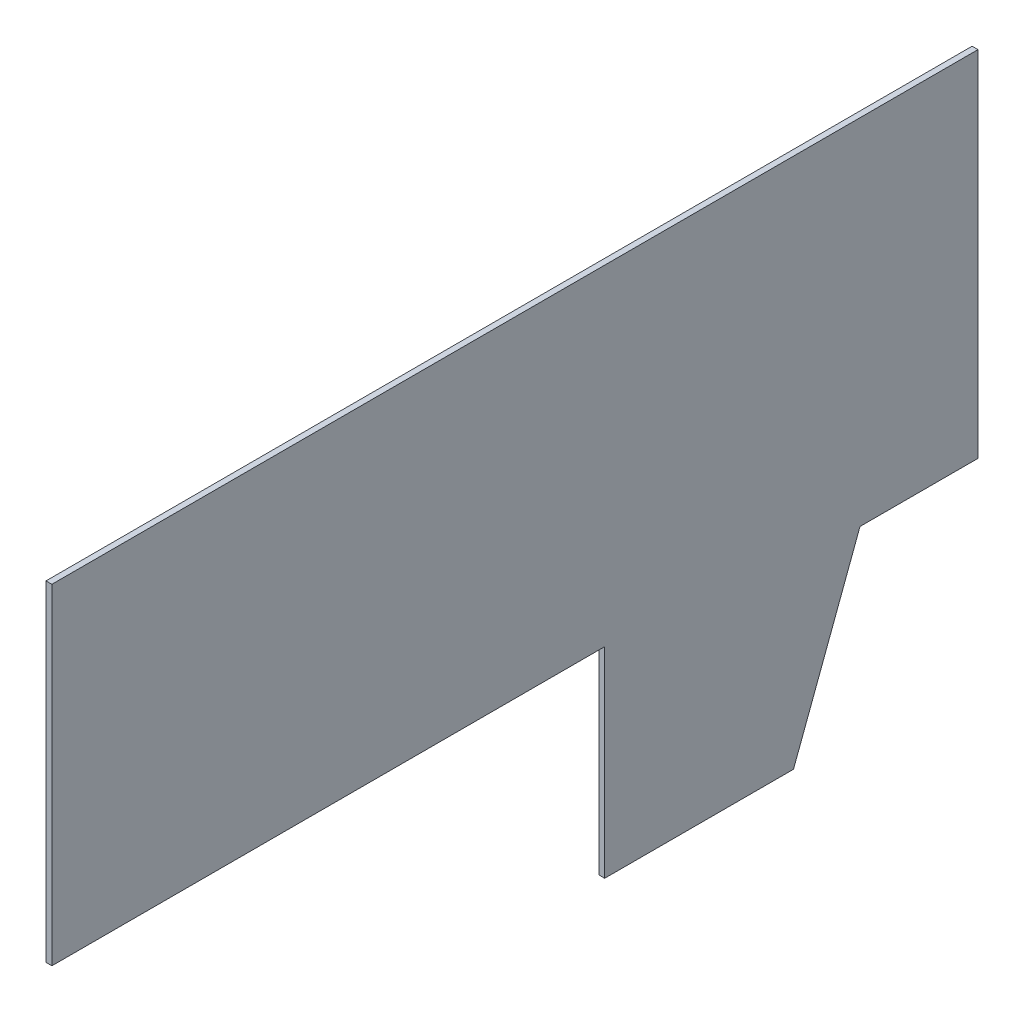
ISO-10303-21;
HEADER;
FILE_DESCRIPTION(('STEP AP214'),'2;1');
FILE_NAME('part.step','',(''),(''),'','','');
FILE_SCHEMA(('AUTOMOTIVE_DESIGN { 1 0 10303 214 1 1 1 1 }'));
ENDSEC;
DATA;
#1=APPLICATION_CONTEXT('core data for automotive mechanical design processes');
#2=APPLICATION_PROTOCOL_DEFINITION('international standard','automotive_design',2000,#1);
#3=PRODUCT_CONTEXT('',#1,'mechanical');
#4=PRODUCT('Part','Part','',(#3));
#5=PRODUCT_RELATED_PRODUCT_CATEGORY('part','',(#4));
#6=PRODUCT_DEFINITION_FORMATION('','',#4);
#7=PRODUCT_DEFINITION_CONTEXT('part definition',#1,'design');
#8=PRODUCT_DEFINITION('design','',#6,#7);
#9=PRODUCT_DEFINITION_SHAPE('','',#8);
#10=(LENGTH_UNIT() NAMED_UNIT(*) SI_UNIT(.MILLI.,.METRE.));
#11=(NAMED_UNIT(*) PLANE_ANGLE_UNIT() SI_UNIT($,.RADIAN.));
#12=(NAMED_UNIT(*) SI_UNIT($,.STERADIAN.) SOLID_ANGLE_UNIT());
#13=UNCERTAINTY_MEASURE_WITH_UNIT(LENGTH_MEASURE(1.E-05),#10,'distance_accuracy_value','');
#14=(GEOMETRIC_REPRESENTATION_CONTEXT(3) GLOBAL_UNCERTAINTY_ASSIGNED_CONTEXT((#13)) GLOBAL_UNIT_ASSIGNED_CONTEXT((#10,
#11,#12)) REPRESENTATION_CONTEXT('',''));
#15=CARTESIAN_POINT('',(0.,0.,0.));
#16=DIRECTION('',(0.,0.,1.));
#17=DIRECTION('',(1.,0.,0.));
#18=AXIS2_PLACEMENT_3D('',#15,#16,#17);
#19=CARTESIAN_POINT('',(1.5875,88.9,-249.174));
#20=DIRECTION('',(0.,0.,1.));
#21=DIRECTION('',(0.,-1.,0.));
#22=AXIS2_PLACEMENT_3D('',#19,#20,#21);
#23=PLANE('',#22);
#24=DIRECTION('',(0.,1.,0.));
#25=VECTOR('',#24,1.);
#26=CARTESIAN_POINT('',(-1.5875,88.9,-249.174));
#27=LINE('',#26,#25);
#28=CARTESIAN_POINT('',(-1.5875,-101.6,-249.174));
#29=VERTEX_POINT('',#28);
#30=CARTESIAN_POINT('',(-1.5875,88.9,-249.174));
#31=VERTEX_POINT('',#30);
#32=EDGE_CURVE('E143',#29,#31,#27,.T.);
#33=ORIENTED_EDGE('',*,*,#32,.T.);
#34=DIRECTION('',(-1.,0.,0.));
#35=VECTOR('',#34,1.);
#36=CARTESIAN_POINT('',(1.5875,88.9,-249.174));
#37=LINE('',#36,#35);
#38=CARTESIAN_POINT('',(1.5875,88.9,-249.174));
#39=VERTEX_POINT('',#38);
#40=EDGE_CURVE('E11',#39,#31,#37,.T.);
#41=ORIENTED_EDGE('',*,*,#40,.F.);
#42=DIRECTION('',(0.,1.,0.));
#43=VECTOR('',#42,1.);
#44=CARTESIAN_POINT('',(1.5875,88.9,-249.174));
#45=LINE('',#44,#43);
#46=CARTESIAN_POINT('',(1.5875,-101.6,-249.174));
#47=VERTEX_POINT('',#46);
#48=EDGE_CURVE('E151',#47,#39,#45,.T.);
#49=ORIENTED_EDGE('',*,*,#48,.F.);
#50=DIRECTION('',(1.,0.,0.));
#51=VECTOR('',#50,1.);
#52=CARTESIAN_POINT('',(-1.5875,-101.6,-249.174));
#53=LINE('',#52,#51);
#54=EDGE_CURVE('E144',#29,#47,#53,.T.);
#55=ORIENTED_EDGE('',*,*,#54,.F.);
#56=EDGE_LOOP('',(#33,#41,#49,#55));
#57=FACE_BOUND('',#56,.T.);
#58=ADVANCED_FACE('F35',(#57),#23,.F.);
#59=CARTESIAN_POINT('',(1.5875,88.9,249.174));
#60=DIRECTION('',(0.,-1.,0.));
#61=DIRECTION('',(0.,0.,-1.));
#62=AXIS2_PLACEMENT_3D('',#59,#60,#61);
#63=PLANE('',#62);
#64=DIRECTION('',(0.,0.,1.));
#65=VECTOR('',#64,1.);
#66=CARTESIAN_POINT('',(-1.5875,88.9,249.174));
#67=LINE('',#66,#65);
#68=CARTESIAN_POINT('',(-1.5875,88.9,249.174));
#69=VERTEX_POINT('',#68);
#70=EDGE_CURVE('E161',#31,#69,#67,.T.);
#71=ORIENTED_EDGE('',*,*,#70,.T.);
#72=DIRECTION('',(-1.,0.,0.));
#73=VECTOR('',#72,1.);
#74=CARTESIAN_POINT('',(1.5875,88.9,249.174));
#75=LINE('',#74,#73);
#76=CARTESIAN_POINT('',(1.5875,88.9,249.174));
#77=VERTEX_POINT('',#76);
#78=EDGE_CURVE('E42',#77,#69,#75,.T.);
#79=ORIENTED_EDGE('',*,*,#78,.F.);
#80=DIRECTION('',(0.,0.,1.));
#81=VECTOR('',#80,1.);
#82=CARTESIAN_POINT('',(1.5875,88.9,249.174));
#83=LINE('',#82,#81);
#84=EDGE_CURVE('E80',#39,#77,#83,.T.);
#85=ORIENTED_EDGE('',*,*,#84,.F.);
#86=ORIENTED_EDGE('',*,*,#40,.T.);
#87=EDGE_LOOP('',(#71,#79,#85,#86));
#88=FACE_BOUND('',#87,.T.);
#89=ADVANCED_FACE('F181',(#88),#63,.F.);
#90=CARTESIAN_POINT('',(1.5875,88.9,249.174));
#91=DIRECTION('',(0.,0.,-1.));
#92=DIRECTION('',(-1.,0.,0.));
#93=AXIS2_PLACEMENT_3D('',#90,#91,#92);
#94=PLANE('',#93);
#95=DIRECTION('',(0.,-1.,0.));
#96=VECTOR('',#95,1.);
#97=CARTESIAN_POINT('',(-1.5875,88.9,249.174));
#98=LINE('',#97,#96);
#99=CARTESIAN_POINT('',(-1.5875,-88.9,249.174));
#100=VERTEX_POINT('',#99);
#101=EDGE_CURVE('E75',#69,#100,#98,.T.);
#102=ORIENTED_EDGE('',*,*,#101,.T.);
#103=DIRECTION('',(-1.,0.,0.));
#104=VECTOR('',#103,1.);
#105=CARTESIAN_POINT('',(1.5875,-88.9,249.174));
#106=LINE('',#105,#104);
#107=CARTESIAN_POINT('',(1.5875,-88.9,249.174));
#108=VERTEX_POINT('',#107);
#109=EDGE_CURVE('E158',#108,#100,#106,.T.);
#110=ORIENTED_EDGE('',*,*,#109,.F.);
#111=DIRECTION('',(0.,-1.,0.));
#112=VECTOR('',#111,1.);
#113=CARTESIAN_POINT('',(1.5875,88.9,249.174));
#114=LINE('',#113,#112);
#115=EDGE_CURVE('E58',#77,#108,#114,.T.);
#116=ORIENTED_EDGE('',*,*,#115,.F.);
#117=ORIENTED_EDGE('',*,*,#78,.T.);
#118=EDGE_LOOP('',(#102,#110,#116,#117));
#119=FACE_BOUND('',#118,.T.);
#120=ADVANCED_FACE('F165',(#119),#94,.F.);
#121=CARTESIAN_POINT('',(1.5875,-88.9,249.174));
#122=DIRECTION('',(0.,1.,0.));
#123=DIRECTION('',(0.,0.,1.));
#124=AXIS2_PLACEMENT_3D('',#121,#122,#123);
#125=PLANE('',#124);
#126=DIRECTION('',(0.,0.,-1.));
#127=VECTOR('',#126,1.);
#128=CARTESIAN_POINT('',(-1.5875,-88.9,249.174));
#129=LINE('',#128,#127);
#130=CARTESIAN_POINT('',(-1.5875,-88.9,-48.2854000000016));
#131=VERTEX_POINT('',#130);
#132=EDGE_CURVE('E153',#100,#131,#129,.T.);
#133=ORIENTED_EDGE('',*,*,#132,.T.);
#134=DIRECTION('',(1.,0.,0.));
#135=VECTOR('',#134,1.);
#136=CARTESIAN_POINT('',(-1.5875,-88.9,-48.2854000000016));
#137=LINE('',#136,#135);
#138=CARTESIAN_POINT('',(1.5875,-88.9,-48.2854000000015));
#139=VERTEX_POINT('',#138);
#140=EDGE_CURVE('E130',#131,#139,#137,.T.);
#141=ORIENTED_EDGE('',*,*,#140,.T.);
#142=DIRECTION('',(0.,0.,-1.));
#143=VECTOR('',#142,1.);
#144=CARTESIAN_POINT('',(1.5875,-88.9,249.174));
#145=LINE('',#144,#143);
#146=EDGE_CURVE('E156',#108,#139,#145,.T.);
#147=ORIENTED_EDGE('',*,*,#146,.F.);
#148=ORIENTED_EDGE('',*,*,#109,.T.);
#149=EDGE_LOOP('',(#133,#141,#147,#148));
#150=FACE_BOUND('',#149,.T.);
#151=ADVANCED_FACE('F167',(#150),#125,.F.);
#152=CARTESIAN_POINT('',(1.5875,0.,0.));
#153=DIRECTION('',(1.,0.,0.));
#154=DIRECTION('',(0.,0.,-1.));
#155=AXIS2_PLACEMENT_3D('',#152,#153,#154);
#156=PLANE('',#155);
#157=ORIENTED_EDGE('',*,*,#48,.T.);
#158=ORIENTED_EDGE('',*,*,#84,.T.);
#159=ORIENTED_EDGE('',*,*,#115,.T.);
#160=ORIENTED_EDGE('',*,*,#146,.T.);
#161=DIRECTION('',(0.,1.,0.));
#162=VECTOR('',#161,1.);
#163=CARTESIAN_POINT('',(1.5875,0.,-48.2854000000016));
#164=LINE('',#163,#162);
#165=CARTESIAN_POINT('',(1.5875,-196.85,-48.2854000000016));
#166=VERTEX_POINT('',#165);
#167=EDGE_CURVE('E49',#166,#139,#164,.T.);
#168=ORIENTED_EDGE('',*,*,#167,.F.);
#169=DIRECTION('',(0.,0.,1.));
#170=VECTOR('',#169,1.);
#171=CARTESIAN_POINT('',(1.5875,-196.85,-1.07552855510562E-13));
#172=LINE('',#171,#170);
#173=CARTESIAN_POINT('',(1.5875,-196.85,-149.885400000002));
#174=VERTEX_POINT('',#173);
#175=EDGE_CURVE('E125',#174,#166,#172,.T.);
#176=ORIENTED_EDGE('',*,*,#175,.F.);
#177=DIRECTION('',(0.,-0.936103293489878,0.351725210807249));
#178=VECTOR('',#177,1.);
#179=CARTESIAN_POINT('',(1.5875,-73.7023733748581,-196.156068243953));
#180=LINE('',#179,#178);
#181=CARTESIAN_POINT('',(1.5875,-101.6,-185.674));
#182=VERTEX_POINT('',#181);
#183=EDGE_CURVE('E134',#182,#174,#180,.T.);
#184=ORIENTED_EDGE('',*,*,#183,.F.);
#185=DIRECTION('',(0.,0.,1.));
#186=VECTOR('',#185,1.);
#187=CARTESIAN_POINT('',(1.5875,-101.6,0.));
#188=LINE('',#187,#186);
#189=EDGE_CURVE('E132',#47,#182,#188,.T.);
#190=ORIENTED_EDGE('',*,*,#189,.F.);
#191=EDGE_LOOP('',(#157,#158,#159,#160,#168,#176,#184,#190));
#192=FACE_BOUND('',#191,.T.);
#193=ADVANCED_FACE('F169',(#192),#156,.T.);
#194=CARTESIAN_POINT('',(-1.5875,0.,0.));
#195=DIRECTION('',(1.,0.,0.));
#196=DIRECTION('',(0.,0.,-1.));
#197=AXIS2_PLACEMENT_3D('',#194,#195,#196);
#198=PLANE('',#197);
#199=ORIENTED_EDGE('',*,*,#32,.F.);
#200=DIRECTION('',(0.,0.,1.));
#201=VECTOR('',#200,1.);
#202=CARTESIAN_POINT('',(-1.5875,-101.6,0.));
#203=LINE('',#202,#201);
#204=CARTESIAN_POINT('',(-1.5875,-101.6,-185.674));
#205=VERTEX_POINT('',#204);
#206=EDGE_CURVE('E127',#29,#205,#203,.T.);
#207=ORIENTED_EDGE('',*,*,#206,.T.);
#208=DIRECTION('',(0.,-0.936103293489878,0.351725210807249));
#209=VECTOR('',#208,1.);
#210=CARTESIAN_POINT('',(-1.5875,-73.7023733748581,-196.156068243953));
#211=LINE('',#210,#209);
#212=CARTESIAN_POINT('',(-1.5875,-196.85,-149.885400000002));
#213=VERTEX_POINT('',#212);
#214=EDGE_CURVE('E117',#205,#213,#211,.T.);
#215=ORIENTED_EDGE('',*,*,#214,.T.);
#216=DIRECTION('',(0.,0.,1.));
#217=VECTOR('',#216,1.);
#218=CARTESIAN_POINT('',(-1.5875,-196.85,-1.07552855510562E-13));
#219=LINE('',#218,#217);
#220=CARTESIAN_POINT('',(-1.5875,-196.85,-48.2854000000016));
#221=VERTEX_POINT('',#220);
#222=EDGE_CURVE('E110',#213,#221,#219,.T.);
#223=ORIENTED_EDGE('',*,*,#222,.T.);
#224=DIRECTION('',(0.,1.,0.));
#225=VECTOR('',#224,1.);
#226=CARTESIAN_POINT('',(-1.5875,0.,-48.2854000000016));
#227=LINE('',#226,#225);
#228=EDGE_CURVE('E115',#221,#131,#227,.T.);
#229=ORIENTED_EDGE('',*,*,#228,.T.);
#230=ORIENTED_EDGE('',*,*,#132,.F.);
#231=ORIENTED_EDGE('',*,*,#101,.F.);
#232=ORIENTED_EDGE('',*,*,#70,.F.);
#233=EDGE_LOOP('',(#199,#207,#215,#223,#229,#230,#231,#232));
#234=FACE_BOUND('',#233,.T.);
#235=ADVANCED_FACE('F112',(#234),#198,.F.);
#236=CARTESIAN_POINT('',(-1.5875,0.,-48.2854000000016));
#237=DIRECTION('',(0.,0.,-1.));
#238=DIRECTION('',(0.,1.,0.));
#239=AXIS2_PLACEMENT_3D('',#236,#237,#238);
#240=PLANE('',#239);
#241=ORIENTED_EDGE('',*,*,#167,.T.);
#242=ORIENTED_EDGE('',*,*,#140,.F.);
#243=ORIENTED_EDGE('',*,*,#228,.F.);
#244=DIRECTION('',(1.,0.,0.));
#245=VECTOR('',#244,1.);
#246=CARTESIAN_POINT('',(-1.5875,-196.85,-48.2854000000016));
#247=LINE('',#246,#245);
#248=EDGE_CURVE('E122',#221,#166,#247,.T.);
#249=ORIENTED_EDGE('',*,*,#248,.T.);
#250=EDGE_LOOP('',(#241,#242,#243,#249));
#251=FACE_BOUND('',#250,.T.);
#252=ADVANCED_FACE('F129',(#251),#240,.F.);
#253=CARTESIAN_POINT('',(-1.5875,-101.6,0.));
#254=DIRECTION('',(0.,1.,0.));
#255=DIRECTION('',(0.,0.,1.));
#256=AXIS2_PLACEMENT_3D('',#253,#254,#255);
#257=PLANE('',#256);
#258=ORIENTED_EDGE('',*,*,#189,.T.);
#259=DIRECTION('',(1.,0.,0.));
#260=VECTOR('',#259,1.);
#261=CARTESIAN_POINT('',(-1.5875,-101.6,-185.674));
#262=LINE('',#261,#260);
#263=EDGE_CURVE('E147',#205,#182,#262,.T.);
#264=ORIENTED_EDGE('',*,*,#263,.F.);
#265=ORIENTED_EDGE('',*,*,#206,.F.);
#266=ORIENTED_EDGE('',*,*,#54,.T.);
#267=EDGE_LOOP('',(#258,#264,#265,#266));
#268=FACE_BOUND('',#267,.T.);
#269=ADVANCED_FACE('F177',(#268),#257,.F.);
#270=CARTESIAN_POINT('',(-1.5875,-73.7023733748581,-196.156068243953));
#271=DIRECTION('',(0.,0.351725210807249,0.936103293489878));
#272=DIRECTION('',(0.,-0.936103293489878,0.351725210807249));
#273=AXIS2_PLACEMENT_3D('',#270,#271,#272);
#274=PLANE('',#273);
#275=ORIENTED_EDGE('',*,*,#183,.T.);
#276=DIRECTION('',(1.,0.,0.));
#277=VECTOR('',#276,1.);
#278=CARTESIAN_POINT('',(-1.5875,-196.85,-149.885400000002));
#279=LINE('',#278,#277);
#280=EDGE_CURVE('E126',#213,#174,#279,.T.);
#281=ORIENTED_EDGE('',*,*,#280,.F.);
#282=ORIENTED_EDGE('',*,*,#214,.F.);
#283=ORIENTED_EDGE('',*,*,#263,.T.);
#284=EDGE_LOOP('',(#275,#281,#282,#283));
#285=FACE_BOUND('',#284,.T.);
#286=ADVANCED_FACE('F173',(#285),#274,.F.);
#287=CARTESIAN_POINT('',(-1.5875,-196.85,-1.07552855510562E-13));
#288=DIRECTION('',(0.,1.,0.));
#289=DIRECTION('',(0.,0.,1.));
#290=AXIS2_PLACEMENT_3D('',#287,#288,#289);
#291=PLANE('',#290);
#292=ORIENTED_EDGE('',*,*,#175,.T.);
#293=ORIENTED_EDGE('',*,*,#248,.F.);
#294=ORIENTED_EDGE('',*,*,#222,.F.);
#295=ORIENTED_EDGE('',*,*,#280,.T.);
#296=EDGE_LOOP('',(#292,#293,#294,#295));
#297=FACE_BOUND('',#296,.T.);
#298=ADVANCED_FACE('F123',(#297),#291,.F.);
#299=CLOSED_SHELL('',(#58,#89,#120,#151,#193,#235,#252,#269,#286,#298));
#300=MANIFOLD_SOLID_BREP('B2',#299);
#301=ADVANCED_BREP_SHAPE_REPRESENTATION('',(#18,#300),#14);
#302=SHAPE_DEFINITION_REPRESENTATION(#9,#301);
ENDSEC;
END-ISO-10303-21;
